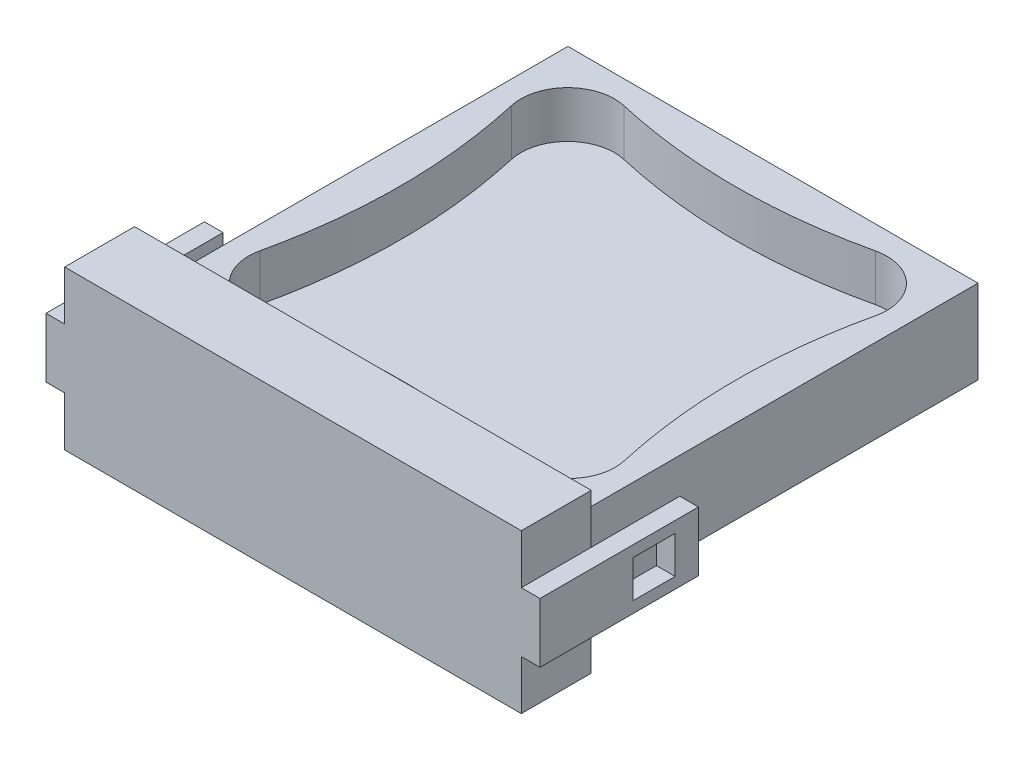
ISO-10303-21;
HEADER;
FILE_DESCRIPTION(('STEP AP214'),'2;1');
FILE_NAME('part.step','',(''),(''),'','','');
FILE_SCHEMA(('AUTOMOTIVE_DESIGN { 1 0 10303 214 1 1 1 1 }'));
ENDSEC;
DATA;
#1=APPLICATION_CONTEXT('core data for automotive mechanical design processes');
#2=APPLICATION_PROTOCOL_DEFINITION('international standard','automotive_design',2000,#1);
#3=PRODUCT_CONTEXT('',#1,'mechanical');
#4=PRODUCT('Part','Part','',(#3));
#5=PRODUCT_RELATED_PRODUCT_CATEGORY('part','',(#4));
#6=PRODUCT_DEFINITION_FORMATION('','',#4);
#7=PRODUCT_DEFINITION_CONTEXT('part definition',#1,'design');
#8=PRODUCT_DEFINITION('design','',#6,#7);
#9=PRODUCT_DEFINITION_SHAPE('','',#8);
#10=(LENGTH_UNIT() NAMED_UNIT(*) SI_UNIT(.MILLI.,.METRE.));
#11=(NAMED_UNIT(*) PLANE_ANGLE_UNIT() SI_UNIT($,.RADIAN.));
#12=(NAMED_UNIT(*) SI_UNIT($,.STERADIAN.) SOLID_ANGLE_UNIT());
#13=UNCERTAINTY_MEASURE_WITH_UNIT(LENGTH_MEASURE(1.E-05),#10,'distance_accuracy_value','');
#14=(GEOMETRIC_REPRESENTATION_CONTEXT(3) GLOBAL_UNCERTAINTY_ASSIGNED_CONTEXT((#13)) GLOBAL_UNIT_ASSIGNED_CONTEXT((#10,
#11,#12)) REPRESENTATION_CONTEXT('',''));
#15=CARTESIAN_POINT('',(0.,0.,0.));
#16=DIRECTION('',(0.,0.,1.));
#17=DIRECTION('',(1.,0.,0.));
#18=AXIS2_PLACEMENT_3D('',#15,#16,#17);
#19=CARTESIAN_POINT('',(-24.5,-4.,29.5));
#20=DIRECTION('',(1.,0.,0.));
#21=DIRECTION('',(0.,0.,-1.));
#22=AXIS2_PLACEMENT_3D('',#19,#20,#21);
#23=PLANE('',#22);
#24=DIRECTION('',(0.,-1.,0.));
#25=VECTOR('',#24,1.);
#26=CARTESIAN_POINT('',(-24.5,-4.,29.5));
#27=LINE('',#26,#25);
#28=CARTESIAN_POINT('',(-24.5,1.3,29.5));
#29=VERTEX_POINT('',#28);
#30=CARTESIAN_POINT('',(-24.5,-4.,29.5));
#31=VERTEX_POINT('',#30);
#32=EDGE_CURVE('E458',#29,#31,#27,.T.);
#33=ORIENTED_EDGE('',*,*,#32,.F.);
#34=DIRECTION('',(0.,0.,-1.));
#35=VECTOR('',#34,1.);
#36=CARTESIAN_POINT('',(-24.5,1.3,12.5));
#37=LINE('',#36,#35);
#38=CARTESIAN_POINT('',(-24.5,1.3,22.));
#39=VERTEX_POINT('',#38);
#40=EDGE_CURVE('E305',#29,#39,#37,.T.);
#41=ORIENTED_EDGE('',*,*,#40,.T.);
#42=DIRECTION('',(0.,-1.,0.));
#43=VECTOR('',#42,1.);
#44=CARTESIAN_POINT('',(-24.5,-4.,22.));
#45=LINE('',#44,#43);
#46=CARTESIAN_POINT('',(-24.5,-4.,22.));
#47=VERTEX_POINT('',#46);
#48=EDGE_CURVE('E481',#39,#47,#45,.T.);
#49=ORIENTED_EDGE('',*,*,#48,.T.);
#50=DIRECTION('',(0.,0.,-1.));
#51=VECTOR('',#50,1.);
#52=CARTESIAN_POINT('',(-24.5,-4.,29.5));
#53=LINE('',#52,#51);
#54=EDGE_CURVE('E462',#31,#47,#53,.T.);
#55=ORIENTED_EDGE('',*,*,#54,.F.);
#56=EDGE_LOOP('',(#33,#41,#49,#55));
#57=FACE_BOUND('',#56,.T.);
#58=ADVANCED_FACE('F33',(#57),#23,.F.);
#59=CARTESIAN_POINT('',(24.5,-4.,29.5));
#60=DIRECTION('',(-1.,0.,0.));
#61=DIRECTION('',(0.,0.,1.));
#62=AXIS2_PLACEMENT_3D('',#59,#60,#61);
#63=PLANE('',#62);
#64=DIRECTION('',(0.,0.,-1.));
#65=VECTOR('',#64,1.);
#66=CARTESIAN_POINT('',(24.5,1.3,12.5));
#67=LINE('',#66,#65);
#68=CARTESIAN_POINT('',(24.5,1.3,29.5));
#69=VERTEX_POINT('',#68);
#70=CARTESIAN_POINT('',(24.5,1.3,22.));
#71=VERTEX_POINT('',#70);
#72=EDGE_CURVE('E58',#69,#71,#67,.T.);
#73=ORIENTED_EDGE('',*,*,#72,.F.);
#74=DIRECTION('',(0.,1.,0.));
#75=VECTOR('',#74,1.);
#76=CARTESIAN_POINT('',(24.5,-4.,29.5));
#77=LINE('',#76,#75);
#78=CARTESIAN_POINT('',(24.5,-4.,29.5));
#79=VERTEX_POINT('',#78);
#80=EDGE_CURVE('E469',#79,#69,#77,.T.);
#81=ORIENTED_EDGE('',*,*,#80,.F.);
#82=DIRECTION('',(0.,0.,-1.));
#83=VECTOR('',#82,1.);
#84=CARTESIAN_POINT('',(24.5,-4.,29.5));
#85=LINE('',#84,#83);
#86=CARTESIAN_POINT('',(24.5,-4.,22.));
#87=VERTEX_POINT('',#86);
#88=EDGE_CURVE('E474',#79,#87,#85,.T.);
#89=ORIENTED_EDGE('',*,*,#88,.T.);
#90=DIRECTION('',(0.,1.,0.));
#91=VECTOR('',#90,1.);
#92=CARTESIAN_POINT('',(24.5,-4.,22.));
#93=LINE('',#92,#91);
#94=EDGE_CURVE('E475',#87,#71,#93,.T.);
#95=ORIENTED_EDGE('',*,*,#94,.T.);
#96=EDGE_LOOP('',(#73,#81,#89,#95));
#97=FACE_BOUND('',#96,.T.);
#98=ADVANCED_FACE('F431',(#97),#63,.F.);
#99=DIRECTION('',(0.,0.,1.));
#100=VECTOR('',#99,1.);
#101=CARTESIAN_POINT('',(24.5,7.7,29.5));
#102=LINE('',#101,#100);
#103=CARTESIAN_POINT('',(24.5,7.7,22.));
#104=VERTEX_POINT('',#103);
#105=CARTESIAN_POINT('',(24.5,7.7,29.5));
#106=VERTEX_POINT('',#105);
#107=EDGE_CURVE('E42',#104,#106,#102,.T.);
#108=ORIENTED_EDGE('',*,*,#107,.F.);
#109=CARTESIAN_POINT('',(24.5,13.,22.));
#110=VERTEX_POINT('',#109);
#111=EDGE_CURVE('E479',#104,#110,#93,.T.);
#112=ORIENTED_EDGE('',*,*,#111,.T.);
#113=DIRECTION('',(0.,0.,-1.));
#114=VECTOR('',#113,1.);
#115=CARTESIAN_POINT('',(24.5,13.,29.5));
#116=LINE('',#115,#114);
#117=CARTESIAN_POINT('',(24.5,13.,29.5));
#118=VERTEX_POINT('',#117);
#119=EDGE_CURVE('E495',#118,#110,#116,.T.);
#120=ORIENTED_EDGE('',*,*,#119,.F.);
#121=EDGE_CURVE('E488',#106,#118,#77,.T.);
#122=ORIENTED_EDGE('',*,*,#121,.F.);
#123=EDGE_LOOP('',(#108,#112,#120,#122));
#124=FACE_BOUND('',#123,.T.);
#125=ADVANCED_FACE('F434',(#124),#63,.F.);
#126=CARTESIAN_POINT('',(22.,9.,22.));
#127=DIRECTION('',(-1.,0.,0.));
#128=DIRECTION('',(0.,0.,1.));
#129=AXIS2_PLACEMENT_3D('',#126,#127,#128);
#130=PLANE('',#129);
#131=DIRECTION('',(0.,0.,-1.));
#132=VECTOR('',#131,1.);
#133=CARTESIAN_POINT('',(22.,0.,22.));
#134=LINE('',#133,#132);
#135=CARTESIAN_POINT('',(22.,0.,22.));
#136=VERTEX_POINT('',#135);
#137=CARTESIAN_POINT('',(22.,0.,-22.));
#138=VERTEX_POINT('',#137);
#139=EDGE_CURVE('E498',#136,#138,#134,.T.);
#140=ORIENTED_EDGE('',*,*,#139,.T.);
#141=DIRECTION('',(0.,-1.,0.));
#142=VECTOR('',#141,1.);
#143=CARTESIAN_POINT('',(22.,9.,-22.));
#144=LINE('',#143,#142);
#145=CARTESIAN_POINT('',(22.,9.,-22.));
#146=VERTEX_POINT('',#145);
#147=EDGE_CURVE('E37',#146,#138,#144,.T.);
#148=ORIENTED_EDGE('',*,*,#147,.F.);
#149=DIRECTION('',(0.,0.,-1.));
#150=VECTOR('',#149,1.);
#151=CARTESIAN_POINT('',(22.,9.,22.));
#152=LINE('',#151,#150);
#153=CARTESIAN_POINT('',(22.,9.,22.));
#154=VERTEX_POINT('',#153);
#155=EDGE_CURVE('E499',#154,#146,#152,.T.);
#156=ORIENTED_EDGE('',*,*,#155,.F.);
#157=DIRECTION('',(0.,-1.,0.));
#158=VECTOR('',#157,1.);
#159=CARTESIAN_POINT('',(22.,9.,22.));
#160=LINE('',#159,#158);
#161=EDGE_CURVE('E509',#154,#136,#160,.T.);
#162=ORIENTED_EDGE('',*,*,#161,.T.);
#163=EDGE_LOOP('',(#140,#148,#156,#162));
#164=FACE_BOUND('',#163,.T.);
#165=ADVANCED_FACE('F35',(#164),#130,.F.);
#166=CARTESIAN_POINT('',(-22.,9.,-22.));
#167=DIRECTION('',(0.,0.,1.));
#168=DIRECTION('',(1.,0.,0.));
#169=AXIS2_PLACEMENT_3D('',#166,#167,#168);
#170=PLANE('',#169);
#171=DIRECTION('',(-1.,0.,0.));
#172=VECTOR('',#171,1.);
#173=CARTESIAN_POINT('',(-22.,0.,-22.));
#174=LINE('',#173,#172);
#175=CARTESIAN_POINT('',(-22.,0.,-22.));
#176=VERTEX_POINT('',#175);
#177=EDGE_CURVE('E512',#138,#176,#174,.T.);
#178=ORIENTED_EDGE('',*,*,#177,.T.);
#179=DIRECTION('',(0.,-1.,0.));
#180=VECTOR('',#179,1.);
#181=CARTESIAN_POINT('',(-22.,9.,-22.));
#182=LINE('',#181,#180);
#183=CARTESIAN_POINT('',(-22.,9.,-22.));
#184=VERTEX_POINT('',#183);
#185=EDGE_CURVE('E522',#184,#176,#182,.T.);
#186=ORIENTED_EDGE('',*,*,#185,.F.);
#187=DIRECTION('',(-1.,0.,0.));
#188=VECTOR('',#187,1.);
#189=CARTESIAN_POINT('',(-22.,9.,-22.));
#190=LINE('',#189,#188);
#191=EDGE_CURVE('E502',#146,#184,#190,.T.);
#192=ORIENTED_EDGE('',*,*,#191,.F.);
#193=ORIENTED_EDGE('',*,*,#147,.T.);
#194=EDGE_LOOP('',(#178,#186,#192,#193));
#195=FACE_BOUND('',#194,.T.);
#196=ADVANCED_FACE('F444',(#195),#170,.F.);
#197=CARTESIAN_POINT('',(-22.,9.,22.));
#198=DIRECTION('',(1.,0.,0.));
#199=DIRECTION('',(0.,0.,-1.));
#200=AXIS2_PLACEMENT_3D('',#197,#198,#199);
#201=PLANE('',#200);
#202=DIRECTION('',(0.,0.,1.));
#203=VECTOR('',#202,1.);
#204=CARTESIAN_POINT('',(-22.,0.,22.));
#205=LINE('',#204,#203);
#206=CARTESIAN_POINT('',(-22.,0.,22.));
#207=VERTEX_POINT('',#206);
#208=EDGE_CURVE('E514',#176,#207,#205,.T.);
#209=ORIENTED_EDGE('',*,*,#208,.T.);
#210=DIRECTION('',(0.,-1.,0.));
#211=VECTOR('',#210,1.);
#212=CARTESIAN_POINT('',(-22.,9.,22.));
#213=LINE('',#212,#211);
#214=CARTESIAN_POINT('',(-22.,9.,22.));
#215=VERTEX_POINT('',#214);
#216=EDGE_CURVE('E520',#215,#207,#213,.T.);
#217=ORIENTED_EDGE('',*,*,#216,.F.);
#218=DIRECTION('',(0.,0.,1.));
#219=VECTOR('',#218,1.);
#220=CARTESIAN_POINT('',(-22.,9.,22.));
#221=LINE('',#220,#219);
#222=EDGE_CURVE('E505',#184,#215,#221,.T.);
#223=ORIENTED_EDGE('',*,*,#222,.F.);
#224=ORIENTED_EDGE('',*,*,#185,.T.);
#225=EDGE_LOOP('',(#209,#217,#223,#224));
#226=FACE_BOUND('',#225,.T.);
#227=ADVANCED_FACE('F438',(#226),#201,.F.);
#228=CARTESIAN_POINT('',(0.,9.,0.));
#229=DIRECTION('',(0.,-1.,0.));
#230=DIRECTION('',(0.,0.,-1.));
#231=AXIS2_PLACEMENT_3D('',#228,#229,#230);
#232=PLANE('',#231);
#233=CARTESIAN_POINT('',(14.6117194583374,9.,-14.582014450334));
#234=DIRECTION('',(0.,1.,0.));
#235=DIRECTION('',(0.,0.,-1.));
#236=AXIS2_PLACEMENT_3D('',#233,#234,#235);
#237=CIRCLE('',#236,5.03941281841845);
#238=CARTESIAN_POINT('',(19.5325,9.,-13.495));
#239=VERTEX_POINT('',#238);
#240=CARTESIAN_POINT('',(13.49,9.,-19.495));
#241=VERTEX_POINT('',#240);
#242=EDGE_CURVE('E624',#239,#241,#237,.T.);
#243=ORIENTED_EDGE('',*,*,#242,.F.);
#244=CARTESIAN_POINT('',(19.5325,9.,13.495));
#245=CARTESIAN_POINT('',(16.4925,9.,0.));
#246=CARTESIAN_POINT('',(19.5325,9.,-13.495));
#247=B_SPLINE_CURVE_WITH_KNOTS('',2,(#244,#245,#246),.UNSPECIFIED.,.F.,.F.,(3,3),(0.,1.),.UNSPECIFIED.);
#248=CARTESIAN_POINT('',(19.5325,9.,13.495));
#249=VERTEX_POINT('',#248);
#250=EDGE_CURVE('E388',#249,#239,#247,.T.);
#251=ORIENTED_EDGE('',*,*,#250,.F.);
#252=CARTESIAN_POINT('',(14.6117194583374,9.,14.5820144503339));
#253=DIRECTION('',(0.,1.,0.));
#254=DIRECTION('',(0.,0.,1.));
#255=AXIS2_PLACEMENT_3D('',#252,#253,#254);
#256=CIRCLE('',#255,5.03941281841845);
#257=CARTESIAN_POINT('',(13.49,9.,19.495));
#258=VERTEX_POINT('',#257);
#259=EDGE_CURVE('E396',#258,#249,#256,.T.);
#260=ORIENTED_EDGE('',*,*,#259,.F.);
#261=CARTESIAN_POINT('',(-13.49,9.,19.495));
#262=CARTESIAN_POINT('',(-4.49666666666666,9.,17.4416666666667));
#263=CARTESIAN_POINT('',(4.49666666666666,9.,17.4416666666667));
#264=CARTESIAN_POINT('',(13.49,9.,19.495));
#265=B_SPLINE_CURVE_WITH_KNOTS('',3,(#261,#262,#263,#264),.UNSPECIFIED.,.F.,.F.,(4,4),(0.,1.),.UNSPECIFIED.);
#266=CARTESIAN_POINT('',(-13.49,9.,19.495));
#267=VERTEX_POINT('',#266);
#268=EDGE_CURVE('E651',#267,#258,#265,.T.);
#269=ORIENTED_EDGE('',*,*,#268,.F.);
#270=CARTESIAN_POINT('',(-14.6291519635378,9.,14.5995704357795));
#271=DIRECTION('',(0.,1.,0.));
#272=DIRECTION('',(0.,0.,1.));
#273=AXIS2_PLACEMENT_3D('',#270,#271,#272);
#274=CIRCLE('',#273,5.02622102720083);
#275=CARTESIAN_POINT('',(-19.5325,9.,13.495));
#276=VERTEX_POINT('',#275);
#277=EDGE_CURVE('E646',#276,#267,#274,.T.);
#278=ORIENTED_EDGE('',*,*,#277,.F.);
#279=CARTESIAN_POINT('',(-19.5325,9.,-13.495));
#280=CARTESIAN_POINT('',(-18.5191666666667,9.,-8.99666666666668));
#281=CARTESIAN_POINT('',(-17.5058333333333,9.,0.));
#282=CARTESIAN_POINT('',(-18.5191666666667,9.,8.99666666666667));
#283=CARTESIAN_POINT('',(-19.5325,9.,13.495));
#284=B_SPLINE_CURVE_WITH_KNOTS('',3,(#279,#280,#281,#282,#283),.UNSPECIFIED.,.F.,.F.,(4,1,4),
(0.,0.5,1.),.UNSPECIFIED.);
#285=CARTESIAN_POINT('',(-19.5325,9.,-13.495));
#286=VERTEX_POINT('',#285);
#287=EDGE_CURVE('E641',#286,#276,#284,.T.);
#288=ORIENTED_EDGE('',*,*,#287,.F.);
#289=CARTESIAN_POINT('',(-14.6291519635378,9.,-14.5995704357795));
#290=DIRECTION('',(0.,1.,0.));
#291=DIRECTION('',(0.,0.,-1.));
#292=AXIS2_PLACEMENT_3D('',#289,#290,#291);
#293=CIRCLE('',#292,5.02622102720083);
#294=CARTESIAN_POINT('',(-13.49,9.,-19.495));
#295=VERTEX_POINT('',#294);
#296=EDGE_CURVE('E635',#295,#286,#293,.T.);
#297=ORIENTED_EDGE('',*,*,#296,.F.);
#298=CARTESIAN_POINT('',(13.49,9.,-19.495));
#299=CARTESIAN_POINT('',(4.49666666666667,9.,-17.4416666666667));
#300=CARTESIAN_POINT('',(-4.49666666666667,9.,-17.4416666666667));
#301=CARTESIAN_POINT('',(-13.49,9.,-19.495));
#302=B_SPLINE_CURVE_WITH_KNOTS('',3,(#298,#299,#300,#301),.UNSPECIFIED.,.F.,.F.,(4,4),(0.,1.),.UNSPECIFIED.);
#303=EDGE_CURVE('E630',#241,#295,#302,.T.);
#304=ORIENTED_EDGE('',*,*,#303,.F.);
#305=EDGE_LOOP('',(#243,#251,#260,#269,#278,#288,#297,#304));
#306=FACE_BOUND('',#305,.T.);
#307=ORIENTED_EDGE('',*,*,#155,.T.);
#308=ORIENTED_EDGE('',*,*,#191,.T.);
#309=ORIENTED_EDGE('',*,*,#222,.T.);
#310=DIRECTION('',(1.,0.,0.));
#311=VECTOR('',#310,1.);
#312=CARTESIAN_POINT('',(-22.,9.,22.));
#313=LINE('',#312,#311);
#314=EDGE_CURVE('E507',#215,#154,#313,.T.);
#315=ORIENTED_EDGE('',*,*,#314,.T.);
#316=EDGE_LOOP('',(#307,#308,#309,#315));
#317=FACE_BOUND('',#316,.T.);
#318=ADVANCED_FACE('F435',(#306,#317),#232,.F.);
#319=CARTESIAN_POINT('',(0.,0.,0.));
#320=DIRECTION('',(0.,-1.,0.));
#321=DIRECTION('',(0.,0.,-1.));
#322=AXIS2_PLACEMENT_3D('',#319,#320,#321);
#323=PLANE('',#322);
#324=ORIENTED_EDGE('',*,*,#139,.F.);
#325=DIRECTION('',(1.,0.,0.));
#326=VECTOR('',#325,1.);
#327=CARTESIAN_POINT('',(-22.,0.,22.));
#328=LINE('',#327,#326);
#329=EDGE_CURVE('E503',#207,#136,#328,.T.);
#330=ORIENTED_EDGE('',*,*,#329,.F.);
#331=ORIENTED_EDGE('',*,*,#208,.F.);
#332=ORIENTED_EDGE('',*,*,#177,.F.);
#333=EDGE_LOOP('',(#324,#330,#331,#332));
#334=FACE_BOUND('',#333,.T.);
#335=ADVANCED_FACE('F429',(#334),#323,.T.);
#336=CARTESIAN_POINT('',(-24.5,13.,29.5));
#337=DIRECTION('',(0.,-1.,0.));
#338=DIRECTION('',(0.,0.,-1.));
#339=AXIS2_PLACEMENT_3D('',#336,#337,#338);
#340=PLANE('',#339);
#341=DIRECTION('',(-1.,0.,0.));
#342=VECTOR('',#341,1.);
#343=CARTESIAN_POINT('',(-24.5,13.,22.));
#344=LINE('',#343,#342);
#345=CARTESIAN_POINT('',(-24.5,13.,22.));
#346=VERTEX_POINT('',#345);
#347=EDGE_CURVE('E477',#110,#346,#344,.T.);
#348=ORIENTED_EDGE('',*,*,#347,.T.);
#349=DIRECTION('',(0.,0.,-1.));
#350=VECTOR('',#349,1.);
#351=CARTESIAN_POINT('',(-24.5,13.,29.5));
#352=LINE('',#351,#350);
#353=CARTESIAN_POINT('',(-24.5,13.,29.5));
#354=VERTEX_POINT('',#353);
#355=EDGE_CURVE('E492',#354,#346,#352,.T.);
#356=ORIENTED_EDGE('',*,*,#355,.F.);
#357=DIRECTION('',(-1.,0.,0.));
#358=VECTOR('',#357,1.);
#359=CARTESIAN_POINT('',(-24.5,13.,29.5));
#360=LINE('',#359,#358);
#361=EDGE_CURVE('E465',#118,#354,#360,.T.);
#362=ORIENTED_EDGE('',*,*,#361,.F.);
#363=ORIENTED_EDGE('',*,*,#119,.T.);
#364=EDGE_LOOP('',(#348,#356,#362,#363));
#365=FACE_BOUND('',#364,.T.);
#366=ADVANCED_FACE('F425',(#365),#340,.F.);
#367=CARTESIAN_POINT('',(-24.5,7.7,22.));
#368=VERTEX_POINT('',#367);
#369=EDGE_CURVE('E482',#346,#368,#45,.T.);
#370=ORIENTED_EDGE('',*,*,#369,.T.);
#371=DIRECTION('',(0.,0.,1.));
#372=VECTOR('',#371,1.);
#373=CARTESIAN_POINT('',(-24.5,7.7,29.5));
#374=LINE('',#373,#372);
#375=CARTESIAN_POINT('',(-24.5,7.7,29.5));
#376=VERTEX_POINT('',#375);
#377=EDGE_CURVE('E11',#368,#376,#374,.T.);
#378=ORIENTED_EDGE('',*,*,#377,.T.);
#379=EDGE_CURVE('E464',#354,#376,#27,.T.);
#380=ORIENTED_EDGE('',*,*,#379,.F.);
#381=ORIENTED_EDGE('',*,*,#355,.T.);
#382=EDGE_LOOP('',(#370,#378,#380,#381));
#383=FACE_BOUND('',#382,.T.);
#384=ADVANCED_FACE('F421',(#383),#23,.F.);
#385=CARTESIAN_POINT('',(-24.5,-4.,29.5));
#386=DIRECTION('',(0.,1.,0.));
#387=DIRECTION('',(0.,0.,1.));
#388=AXIS2_PLACEMENT_3D('',#385,#386,#387);
#389=PLANE('',#388);
#390=DIRECTION('',(1.,0.,0.));
#391=VECTOR('',#390,1.);
#392=CARTESIAN_POINT('',(-24.5,-4.,22.));
#393=LINE('',#392,#391);
#394=EDGE_CURVE('E485',#47,#87,#393,.T.);
#395=ORIENTED_EDGE('',*,*,#394,.T.);
#396=ORIENTED_EDGE('',*,*,#88,.F.);
#397=DIRECTION('',(1.,0.,0.));
#398=VECTOR('',#397,1.);
#399=CARTESIAN_POINT('',(-24.5,-4.,29.5));
#400=LINE('',#399,#398);
#401=EDGE_CURVE('E468',#31,#79,#400,.T.);
#402=ORIENTED_EDGE('',*,*,#401,.F.);
#403=ORIENTED_EDGE('',*,*,#54,.T.);
#404=EDGE_LOOP('',(#395,#396,#402,#403));
#405=FACE_BOUND('',#404,.T.);
#406=ADVANCED_FACE('F414',(#405),#389,.F.);
#407=CARTESIAN_POINT('',(0.,0.,29.5));
#408=DIRECTION('',(0.,0.,-1.));
#409=DIRECTION('',(-1.,0.,0.));
#410=AXIS2_PLACEMENT_3D('',#407,#408,#409);
#411=PLANE('',#410);
#412=ORIENTED_EDGE('',*,*,#80,.T.);
#413=DIRECTION('',(-1.,0.,0.));
#414=VECTOR('',#413,1.);
#415=CARTESIAN_POINT('',(26.5,1.3,29.5));
#416=LINE('',#415,#414);
#417=CARTESIAN_POINT('',(26.5,1.3,29.5));
#418=VERTEX_POINT('',#417);
#419=EDGE_CURVE('E385',#418,#69,#416,.T.);
#420=ORIENTED_EDGE('',*,*,#419,.F.);
#421=DIRECTION('',(0.,-1.,0.));
#422=VECTOR('',#421,1.);
#423=CARTESIAN_POINT('',(26.5,1.3,29.5));
#424=LINE('',#423,#422);
#425=CARTESIAN_POINT('',(26.5,7.7,29.5));
#426=VERTEX_POINT('',#425);
#427=EDGE_CURVE('E360',#426,#418,#424,.T.);
#428=ORIENTED_EDGE('',*,*,#427,.F.);
#429=DIRECTION('',(-1.,0.,0.));
#430=VECTOR('',#429,1.);
#431=CARTESIAN_POINT('',(26.5,7.7,29.5));
#432=LINE('',#431,#430);
#433=EDGE_CURVE('E371',#426,#106,#432,.T.);
#434=ORIENTED_EDGE('',*,*,#433,.T.);
#435=ORIENTED_EDGE('',*,*,#121,.T.);
#436=ORIENTED_EDGE('',*,*,#361,.T.);
#437=ORIENTED_EDGE('',*,*,#379,.T.);
#438=DIRECTION('',(1.,0.,0.));
#439=VECTOR('',#438,1.);
#440=CARTESIAN_POINT('',(-26.5,7.7,29.5));
#441=LINE('',#440,#439);
#442=CARTESIAN_POINT('',(-26.5,7.7,29.5));
#443=VERTEX_POINT('',#442);
#444=EDGE_CURVE('E51',#443,#376,#441,.T.);
#445=ORIENTED_EDGE('',*,*,#444,.F.);
#446=DIRECTION('',(0.,-1.,0.));
#447=VECTOR('',#446,1.);
#448=CARTESIAN_POINT('',(-26.5,1.3,29.5));
#449=LINE('',#448,#447);
#450=CARTESIAN_POINT('',(-26.5,1.3,29.5));
#451=VERTEX_POINT('',#450);
#452=EDGE_CURVE('E301',#443,#451,#449,.T.);
#453=ORIENTED_EDGE('',*,*,#452,.T.);
#454=DIRECTION('',(1.,0.,0.));
#455=VECTOR('',#454,1.);
#456=CARTESIAN_POINT('',(-26.5,1.3,29.5));
#457=LINE('',#456,#455);
#458=EDGE_CURVE('E312',#451,#29,#457,.T.);
#459=ORIENTED_EDGE('',*,*,#458,.T.);
#460=ORIENTED_EDGE('',*,*,#32,.T.);
#461=ORIENTED_EDGE('',*,*,#401,.T.);
#462=EDGE_LOOP('',(#412,#420,#428,#434,#435,#436,#437,#445,#453,#459,#460,#461));
#463=FACE_BOUND('',#462,.T.);
#464=ADVANCED_FACE('F411',(#463),#411,.F.);
#465=CARTESIAN_POINT('',(0.,0.,22.));
#466=DIRECTION('',(0.,0.,-1.));
#467=DIRECTION('',(-1.,0.,0.));
#468=AXIS2_PLACEMENT_3D('',#465,#466,#467);
#469=PLANE('',#468);
#470=ORIENTED_EDGE('',*,*,#216,.T.);
#471=ORIENTED_EDGE('',*,*,#329,.T.);
#472=ORIENTED_EDGE('',*,*,#161,.F.);
#473=ORIENTED_EDGE('',*,*,#314,.F.);
#474=EDGE_LOOP('',(#470,#471,#472,#473));
#475=FACE_BOUND('',#474,.T.);
#476=ORIENTED_EDGE('',*,*,#94,.F.);
#477=ORIENTED_EDGE('',*,*,#394,.F.);
#478=ORIENTED_EDGE('',*,*,#48,.F.);
#479=EDGE_CURVE('E486',#368,#39,#45,.T.);
#480=ORIENTED_EDGE('',*,*,#479,.F.);
#481=ORIENTED_EDGE('',*,*,#369,.F.);
#482=ORIENTED_EDGE('',*,*,#347,.F.);
#483=ORIENTED_EDGE('',*,*,#111,.F.);
#484=EDGE_CURVE('E478',#71,#104,#93,.T.);
#485=ORIENTED_EDGE('',*,*,#484,.F.);
#486=EDGE_LOOP('',(#476,#477,#478,#480,#481,#482,#483,#485));
#487=FACE_BOUND('',#486,.T.);
#488=ADVANCED_FACE('F407',(#475,#487),#469,.T.);
#489=CARTESIAN_POINT('',(19.5325,4.,13.495));
#490=CARTESIAN_POINT('',(16.4925,4.,0.));
#491=CARTESIAN_POINT('',(19.5325,4.,-13.495));
#492=B_SPLINE_CURVE_WITH_KNOTS('',2,(#489,#490,#491),.UNSPECIFIED.,.F.,.F.,(3,3),(0.,1.),.UNSPECIFIED.);
#493=DIRECTION('',(0.,1.,0.));
#494=VECTOR('',#493,1.);
#495=SURFACE_OF_LINEAR_EXTRUSION('',#492,#494);
#496=ORIENTED_EDGE('',*,*,#250,.T.);
#497=DIRECTION('',(0.,1.,0.));
#498=VECTOR('',#497,1.);
#499=CARTESIAN_POINT('',(19.5325,4.,-13.495));
#500=LINE('',#499,#498);
#501=CARTESIAN_POINT('',(19.5325,4.,-13.495));
#502=VERTEX_POINT('',#501);
#503=EDGE_CURVE('E574',#502,#239,#500,.T.);
#504=ORIENTED_EDGE('',*,*,#503,.F.);
#505=CARTESIAN_POINT('',(19.5325,4.,13.495));
#506=VERTEX_POINT('',#505);
#507=EDGE_CURVE('E389',#506,#502,#492,.T.);
#508=ORIENTED_EDGE('',*,*,#507,.F.);
#509=DIRECTION('',(0.,1.,0.));
#510=VECTOR('',#509,1.);
#511=CARTESIAN_POINT('',(19.5325,4.,13.495));
#512=LINE('',#511,#510);
#513=EDGE_CURVE('E553',#506,#249,#512,.T.);
#514=ORIENTED_EDGE('',*,*,#513,.T.);
#515=EDGE_LOOP('',(#496,#504,#508,#514));
#516=FACE_BOUND('',#515,.T.);
#517=ADVANCED_FACE('F402',(#516),#495,.F.);
#518=CARTESIAN_POINT('',(14.6117194583374,4.,14.5820144503339));
#519=DIRECTION('',(0.,1.,0.));
#520=DIRECTION('',(0.,0.,1.));
#521=AXIS2_PLACEMENT_3D('',#518,#519,#520);
#522=CYLINDRICAL_SURFACE('',#521,5.03941281841845);
#523=ORIENTED_EDGE('',*,*,#259,.T.);
#524=ORIENTED_EDGE('',*,*,#513,.F.);
#525=CARTESIAN_POINT('',(14.6117194583374,4.,14.5820144503339));
#526=DIRECTION('',(0.,1.,0.));
#527=DIRECTION('',(0.,0.,1.));
#528=AXIS2_PLACEMENT_3D('',#525,#526,#527);
#529=CIRCLE('',#528,5.03941281841845);
#530=CARTESIAN_POINT('',(13.49,4.,19.495));
#531=VERTEX_POINT('',#530);
#532=EDGE_CURVE('E576',#531,#506,#529,.T.);
#533=ORIENTED_EDGE('',*,*,#532,.F.);
#534=DIRECTION('',(0.,1.,0.));
#535=VECTOR('',#534,1.);
#536=CARTESIAN_POINT('',(13.49,4.,19.495));
#537=LINE('',#536,#535);
#538=EDGE_CURVE('E556',#531,#258,#537,.T.);
#539=ORIENTED_EDGE('',*,*,#538,.T.);
#540=EDGE_LOOP('',(#523,#524,#533,#539));
#541=FACE_BOUND('',#540,.T.);
#542=ADVANCED_FACE('F406',(#541),#522,.F.);
#543=CARTESIAN_POINT('',(-13.49,4.,19.495));
#544=CARTESIAN_POINT('',(-4.49666666666666,4.,17.4416666666667));
#545=CARTESIAN_POINT('',(4.49666666666666,4.,17.4416666666667));
#546=CARTESIAN_POINT('',(13.49,4.,19.495));
#547=B_SPLINE_CURVE_WITH_KNOTS('',3,(#543,#544,#545,#546),.UNSPECIFIED.,.F.,.F.,(4,4),(0.,1.),.UNSPECIFIED.);
#548=DIRECTION('',(0.,1.,0.));
#549=VECTOR('',#548,1.);
#550=SURFACE_OF_LINEAR_EXTRUSION('',#547,#549);
#551=ORIENTED_EDGE('',*,*,#268,.T.);
#552=ORIENTED_EDGE('',*,*,#538,.F.);
#553=CARTESIAN_POINT('',(-13.49,4.,19.495));
#554=VERTEX_POINT('',#553);
#555=EDGE_CURVE('E607',#554,#531,#547,.T.);
#556=ORIENTED_EDGE('',*,*,#555,.F.);
#557=DIRECTION('',(0.,1.,0.));
#558=VECTOR('',#557,1.);
#559=CARTESIAN_POINT('',(-13.49,4.,19.495));
#560=LINE('',#559,#558);
#561=EDGE_CURVE('E560',#554,#267,#560,.T.);
#562=ORIENTED_EDGE('',*,*,#561,.T.);
#563=EDGE_LOOP('',(#551,#552,#556,#562));
#564=FACE_BOUND('',#563,.T.);
#565=ADVANCED_FACE('F599',(#564),#550,.F.);
#566=CARTESIAN_POINT('',(-14.6291519635378,4.,14.5995704357795));
#567=DIRECTION('',(0.,1.,0.));
#568=DIRECTION('',(0.,0.,1.));
#569=AXIS2_PLACEMENT_3D('',#566,#567,#568);
#570=CYLINDRICAL_SURFACE('',#569,5.02622102720083);
#571=ORIENTED_EDGE('',*,*,#277,.T.);
#572=ORIENTED_EDGE('',*,*,#561,.F.);
#573=CARTESIAN_POINT('',(-14.6291519635378,4.,14.5995704357795));
#574=DIRECTION('',(0.,1.,0.));
#575=DIRECTION('',(0.,0.,1.));
#576=AXIS2_PLACEMENT_3D('',#573,#574,#575);
#577=CIRCLE('',#576,5.02622102720083);
#578=CARTESIAN_POINT('',(-19.5325,4.,13.495));
#579=VERTEX_POINT('',#578);
#580=EDGE_CURVE('E614',#579,#554,#577,.T.);
#581=ORIENTED_EDGE('',*,*,#580,.F.);
#582=DIRECTION('',(0.,1.,0.));
#583=VECTOR('',#582,1.);
#584=CARTESIAN_POINT('',(-19.5325,4.,13.495));
#585=LINE('',#584,#583);
#586=EDGE_CURVE('E566',#579,#276,#585,.T.);
#587=ORIENTED_EDGE('',*,*,#586,.T.);
#588=EDGE_LOOP('',(#571,#572,#581,#587));
#589=FACE_BOUND('',#588,.T.);
#590=ADVANCED_FACE('F604',(#589),#570,.F.);
#591=CARTESIAN_POINT('',(-19.5325,4.,-13.495));
#592=CARTESIAN_POINT('',(-18.5191666666667,4.,-8.99666666666668));
#593=CARTESIAN_POINT('',(-17.5058333333333,4.,0.));
#594=CARTESIAN_POINT('',(-18.5191666666667,4.,8.99666666666667));
#595=CARTESIAN_POINT('',(-19.5325,4.,13.495));
#596=B_SPLINE_CURVE_WITH_KNOTS('',3,(#591,#592,#593,#594,#595),.UNSPECIFIED.,.F.,.F.,(4,1,4),
(0.,0.5,1.),.UNSPECIFIED.);
#597=DIRECTION('',(0.,1.,0.));
#598=VECTOR('',#597,1.);
#599=SURFACE_OF_LINEAR_EXTRUSION('',#596,#598);
#600=ORIENTED_EDGE('',*,*,#287,.T.);
#601=ORIENTED_EDGE('',*,*,#586,.F.);
#602=CARTESIAN_POINT('',(-19.5325,4.,-13.495));
#603=VERTEX_POINT('',#602);
#604=EDGE_CURVE('E682',#603,#579,#596,.T.);
#605=ORIENTED_EDGE('',*,*,#604,.F.);
#606=DIRECTION('',(0.,1.,0.));
#607=VECTOR('',#606,1.);
#608=CARTESIAN_POINT('',(-19.5325,4.,-13.495));
#609=LINE('',#608,#607);
#610=EDGE_CURVE('E568',#603,#286,#609,.T.);
#611=ORIENTED_EDGE('',*,*,#610,.T.);
#612=EDGE_LOOP('',(#600,#601,#605,#611));
#613=FACE_BOUND('',#612,.T.);
#614=ADVANCED_FACE('F680',(#613),#599,.F.);
#615=CARTESIAN_POINT('',(-14.6291519635378,4.,-14.5995704357795));
#616=DIRECTION('',(0.,1.,0.));
#617=DIRECTION('',(0.,0.,1.));
#618=AXIS2_PLACEMENT_3D('',#615,#616,#617);
#619=CYLINDRICAL_SURFACE('',#618,5.02622102720083);
#620=ORIENTED_EDGE('',*,*,#296,.T.);
#621=ORIENTED_EDGE('',*,*,#610,.F.);
#622=CARTESIAN_POINT('',(-14.6291519635378,4.,-14.5995704357795));
#623=DIRECTION('',(0.,1.,0.));
#624=DIRECTION('',(0.,0.,-1.));
#625=AXIS2_PLACEMENT_3D('',#622,#623,#624);
#626=CIRCLE('',#625,5.02622102720083);
#627=CARTESIAN_POINT('',(-13.49,4.,-19.495));
#628=VERTEX_POINT('',#627);
#629=EDGE_CURVE('E687',#628,#603,#626,.T.);
#630=ORIENTED_EDGE('',*,*,#629,.F.);
#631=DIRECTION('',(0.,1.,0.));
#632=VECTOR('',#631,1.);
#633=CARTESIAN_POINT('',(-13.49,4.,-19.495));
#634=LINE('',#633,#632);
#635=EDGE_CURVE('E570',#628,#295,#634,.T.);
#636=ORIENTED_EDGE('',*,*,#635,.T.);
#637=EDGE_LOOP('',(#620,#621,#630,#636));
#638=FACE_BOUND('',#637,.T.);
#639=ADVANCED_FACE('F686',(#638),#619,.F.);
#640=CARTESIAN_POINT('',(13.49,4.,-19.495));
#641=CARTESIAN_POINT('',(4.49666666666667,4.,-17.4416666666667));
#642=CARTESIAN_POINT('',(-4.49666666666667,4.,-17.4416666666667));
#643=CARTESIAN_POINT('',(-13.49,4.,-19.495));
#644=B_SPLINE_CURVE_WITH_KNOTS('',3,(#640,#641,#642,#643),.UNSPECIFIED.,.F.,.F.,(4,4),(0.,1.),.UNSPECIFIED.);
#645=DIRECTION('',(0.,1.,0.));
#646=VECTOR('',#645,1.);
#647=SURFACE_OF_LINEAR_EXTRUSION('',#644,#646);
#648=ORIENTED_EDGE('',*,*,#303,.T.);
#649=ORIENTED_EDGE('',*,*,#635,.F.);
#650=CARTESIAN_POINT('',(13.49,4.,-19.495));
#651=VERTEX_POINT('',#650);
#652=EDGE_CURVE('E670',#651,#628,#644,.T.);
#653=ORIENTED_EDGE('',*,*,#652,.F.);
#654=DIRECTION('',(0.,1.,0.));
#655=VECTOR('',#654,1.);
#656=CARTESIAN_POINT('',(13.49,4.,-19.495));
#657=LINE('',#656,#655);
#658=EDGE_CURVE('E572',#651,#241,#657,.T.);
#659=ORIENTED_EDGE('',*,*,#658,.T.);
#660=EDGE_LOOP('',(#648,#649,#653,#659));
#661=FACE_BOUND('',#660,.T.);
#662=ADVANCED_FACE('F689',(#661),#647,.F.);
#663=CARTESIAN_POINT('',(14.6117194583374,4.,-14.582014450334));
#664=DIRECTION('',(0.,1.,0.));
#665=DIRECTION('',(0.,0.,1.));
#666=AXIS2_PLACEMENT_3D('',#663,#664,#665);
#667=CYLINDRICAL_SURFACE('',#666,5.03941281841845);
#668=ORIENTED_EDGE('',*,*,#242,.T.);
#669=ORIENTED_EDGE('',*,*,#658,.F.);
#670=CARTESIAN_POINT('',(14.6117194583374,4.,-14.582014450334));
#671=DIRECTION('',(0.,1.,0.));
#672=DIRECTION('',(0.,0.,-1.));
#673=AXIS2_PLACEMENT_3D('',#670,#671,#672);
#674=CIRCLE('',#673,5.03941281841845);
#675=EDGE_CURVE('E395',#502,#651,#674,.T.);
#676=ORIENTED_EDGE('',*,*,#675,.F.);
#677=ORIENTED_EDGE('',*,*,#503,.T.);
#678=EDGE_LOOP('',(#668,#669,#676,#677));
#679=FACE_BOUND('',#678,.T.);
#680=ADVANCED_FACE('F409',(#679),#667,.F.);
#681=CARTESIAN_POINT('',(18.0125,4.,0.));
#682=DIRECTION('',(0.,-1.,0.));
#683=DIRECTION('',(0.,0.,-1.));
#684=AXIS2_PLACEMENT_3D('',#681,#682,#683);
#685=PLANE('',#684);
#686=ORIENTED_EDGE('',*,*,#507,.T.);
#687=ORIENTED_EDGE('',*,*,#675,.T.);
#688=ORIENTED_EDGE('',*,*,#652,.T.);
#689=ORIENTED_EDGE('',*,*,#629,.T.);
#690=ORIENTED_EDGE('',*,*,#604,.T.);
#691=ORIENTED_EDGE('',*,*,#580,.T.);
#692=ORIENTED_EDGE('',*,*,#555,.T.);
#693=ORIENTED_EDGE('',*,*,#532,.T.);
#694=EDGE_LOOP('',(#686,#687,#688,#689,#690,#691,#692,#693));
#695=FACE_BOUND('',#694,.T.);
#696=ADVANCED_FACE('F593',(#695),#685,.F.);
#697=CARTESIAN_POINT('',(26.5,0.,0.));
#698=DIRECTION('',(-1.,0.,0.));
#699=DIRECTION('',(0.,0.,1.));
#700=AXIS2_PLACEMENT_3D('',#697,#698,#699);
#701=PLANE('',#700);
#702=ORIENTED_EDGE('',*,*,#427,.T.);
#703=DIRECTION('',(0.,0.,-1.));
#704=VECTOR('',#703,1.);
#705=CARTESIAN_POINT('',(26.5,1.3,12.5));
#706=LINE('',#705,#704);
#707=CARTESIAN_POINT('',(26.5,1.3,12.5));
#708=VERTEX_POINT('',#707);
#709=EDGE_CURVE('E363',#418,#708,#706,.T.);
#710=ORIENTED_EDGE('',*,*,#709,.T.);
#711=DIRECTION('',(0.,1.,0.));
#712=VECTOR('',#711,1.);
#713=CARTESIAN_POINT('',(26.5,7.7,12.5));
#714=LINE('',#713,#712);
#715=CARTESIAN_POINT('',(26.5,7.7,12.5));
#716=VERTEX_POINT('',#715);
#717=EDGE_CURVE('E366',#708,#716,#714,.T.);
#718=ORIENTED_EDGE('',*,*,#717,.T.);
#719=DIRECTION('',(0.,0.,1.));
#720=VECTOR('',#719,1.);
#721=CARTESIAN_POINT('',(26.5,7.7,29.5));
#722=LINE('',#721,#720);
#723=EDGE_CURVE('E368',#716,#426,#722,.T.);
#724=ORIENTED_EDGE('',*,*,#723,.T.);
#725=EDGE_LOOP('',(#702,#710,#718,#724));
#726=FACE_BOUND('',#725,.T.);
#727=DIRECTION('',(0.,1.,0.));
#728=VECTOR('',#727,1.);
#729=CARTESIAN_POINT('',(26.5,2.5,15.));
#730=LINE('',#729,#728);
#731=CARTESIAN_POINT('',(26.5,2.5,15.));
#732=VERTEX_POINT('',#731);
#733=CARTESIAN_POINT('',(26.5,6.5,15.));
#734=VERTEX_POINT('',#733);
#735=EDGE_CURVE('E329',#732,#734,#730,.T.);
#736=ORIENTED_EDGE('',*,*,#735,.F.);
#737=DIRECTION('',(0.,0.,-1.));
#738=VECTOR('',#737,1.);
#739=CARTESIAN_POINT('',(26.5,2.5,19.5));
#740=LINE('',#739,#738);
#741=CARTESIAN_POINT('',(26.5,2.5,19.5));
#742=VERTEX_POINT('',#741);
#743=EDGE_CURVE('E337',#742,#732,#740,.T.);
#744=ORIENTED_EDGE('',*,*,#743,.F.);
#745=DIRECTION('',(0.,-1.,0.));
#746=VECTOR('',#745,1.);
#747=CARTESIAN_POINT('',(26.5,2.5,19.5));
#748=LINE('',#747,#746);
#749=CARTESIAN_POINT('',(26.5,6.5,19.5));
#750=VERTEX_POINT('',#749);
#751=EDGE_CURVE('E334',#750,#742,#748,.T.);
#752=ORIENTED_EDGE('',*,*,#751,.F.);
#753=DIRECTION('',(0.,0.,1.));
#754=VECTOR('',#753,1.);
#755=CARTESIAN_POINT('',(26.5,6.5,19.5));
#756=LINE('',#755,#754);
#757=EDGE_CURVE('E331',#734,#750,#756,.T.);
#758=ORIENTED_EDGE('',*,*,#757,.F.);
#759=EDGE_LOOP('',(#736,#744,#752,#758));
#760=FACE_BOUND('',#759,.T.);
#761=ADVANCED_FACE('F540',(#726,#760),#701,.F.);
#762=CARTESIAN_POINT('',(24.5,0.,0.));
#763=DIRECTION('',(-1.,0.,0.));
#764=DIRECTION('',(0.,0.,1.));
#765=AXIS2_PLACEMENT_3D('',#762,#763,#764);
#766=PLANE('',#765);
#767=CARTESIAN_POINT('',(24.5,1.3,12.5));
#768=VERTEX_POINT('',#767);
#769=EDGE_CURVE('E359',#71,#768,#67,.T.);
#770=ORIENTED_EDGE('',*,*,#769,.F.);
#771=ORIENTED_EDGE('',*,*,#484,.T.);
#772=CARTESIAN_POINT('',(24.5,7.7,12.5));
#773=VERTEX_POINT('',#772);
#774=EDGE_CURVE('E364',#773,#104,#102,.T.);
#775=ORIENTED_EDGE('',*,*,#774,.F.);
#776=DIRECTION('',(0.,1.,0.));
#777=VECTOR('',#776,1.);
#778=CARTESIAN_POINT('',(24.5,7.7,12.5));
#779=LINE('',#778,#777);
#780=EDGE_CURVE('E373',#768,#773,#779,.T.);
#781=ORIENTED_EDGE('',*,*,#780,.F.);
#782=EDGE_LOOP('',(#770,#771,#775,#781));
#783=FACE_BOUND('',#782,.T.);
#784=DIRECTION('',(0.,0.,-1.));
#785=VECTOR('',#784,1.);
#786=CARTESIAN_POINT('',(24.5,2.5,19.5));
#787=LINE('',#786,#785);
#788=CARTESIAN_POINT('',(24.5,2.5,19.5));
#789=VERTEX_POINT('',#788);
#790=CARTESIAN_POINT('',(24.5,2.5,15.));
#791=VERTEX_POINT('',#790);
#792=EDGE_CURVE('E332',#789,#791,#787,.T.);
#793=ORIENTED_EDGE('',*,*,#792,.T.);
#794=DIRECTION('',(0.,1.,0.));
#795=VECTOR('',#794,1.);
#796=CARTESIAN_POINT('',(24.5,2.5,15.));
#797=LINE('',#796,#795);
#798=CARTESIAN_POINT('',(24.5,6.5,15.));
#799=VERTEX_POINT('',#798);
#800=EDGE_CURVE('E328',#791,#799,#797,.T.);
#801=ORIENTED_EDGE('',*,*,#800,.T.);
#802=DIRECTION('',(0.,0.,1.));
#803=VECTOR('',#802,1.);
#804=CARTESIAN_POINT('',(24.5,6.5,19.5));
#805=LINE('',#804,#803);
#806=CARTESIAN_POINT('',(24.5,6.5,19.5));
#807=VERTEX_POINT('',#806);
#808=EDGE_CURVE('E342',#799,#807,#805,.T.);
#809=ORIENTED_EDGE('',*,*,#808,.T.);
#810=DIRECTION('',(0.,-1.,0.));
#811=VECTOR('',#810,1.);
#812=CARTESIAN_POINT('',(24.5,2.5,19.5));
#813=LINE('',#812,#811);
#814=EDGE_CURVE('E345',#807,#789,#813,.T.);
#815=ORIENTED_EDGE('',*,*,#814,.T.);
#816=EDGE_LOOP('',(#793,#801,#809,#815));
#817=FACE_BOUND('',#816,.T.);
#818=ADVANCED_FACE('F549',(#783,#817),#766,.T.);
#819=CARTESIAN_POINT('',(26.5,1.3,12.5));
#820=DIRECTION('',(0.,1.,0.));
#821=DIRECTION('',(0.,0.,1.));
#822=AXIS2_PLACEMENT_3D('',#819,#820,#821);
#823=PLANE('',#822);
#824=ORIENTED_EDGE('',*,*,#72,.T.);
#825=ORIENTED_EDGE('',*,*,#769,.T.);
#826=DIRECTION('',(-1.,0.,0.));
#827=VECTOR('',#826,1.);
#828=CARTESIAN_POINT('',(26.5,1.3,12.5));
#829=LINE('',#828,#827);
#830=EDGE_CURVE('E382',#708,#768,#829,.T.);
#831=ORIENTED_EDGE('',*,*,#830,.F.);
#832=ORIENTED_EDGE('',*,*,#709,.F.);
#833=ORIENTED_EDGE('',*,*,#419,.T.);
#834=EDGE_LOOP('',(#824,#825,#831,#832,#833));
#835=FACE_BOUND('',#834,.T.);
#836=ADVANCED_FACE('F579',(#835),#823,.F.);
#837=CARTESIAN_POINT('',(26.5,7.7,12.5));
#838=DIRECTION('',(0.,0.,1.));
#839=DIRECTION('',(1.,0.,0.));
#840=AXIS2_PLACEMENT_3D('',#837,#838,#839);
#841=PLANE('',#840);
#842=ORIENTED_EDGE('',*,*,#780,.T.);
#843=DIRECTION('',(-1.,0.,0.));
#844=VECTOR('',#843,1.);
#845=CARTESIAN_POINT('',(26.5,7.7,12.5));
#846=LINE('',#845,#844);
#847=EDGE_CURVE('E379',#716,#773,#846,.T.);
#848=ORIENTED_EDGE('',*,*,#847,.F.);
#849=ORIENTED_EDGE('',*,*,#717,.F.);
#850=ORIENTED_EDGE('',*,*,#830,.T.);
#851=EDGE_LOOP('',(#842,#848,#849,#850));
#852=FACE_BOUND('',#851,.T.);
#853=ADVANCED_FACE('F581',(#852),#841,.F.);
#854=CARTESIAN_POINT('',(26.5,7.7,29.5));
#855=DIRECTION('',(0.,-1.,0.));
#856=DIRECTION('',(0.,0.,-1.));
#857=AXIS2_PLACEMENT_3D('',#854,#855,#856);
#858=PLANE('',#857);
#859=ORIENTED_EDGE('',*,*,#774,.T.);
#860=ORIENTED_EDGE('',*,*,#107,.T.);
#861=ORIENTED_EDGE('',*,*,#433,.F.);
#862=ORIENTED_EDGE('',*,*,#723,.F.);
#863=ORIENTED_EDGE('',*,*,#847,.T.);
#864=EDGE_LOOP('',(#859,#860,#861,#862,#863));
#865=FACE_BOUND('',#864,.T.);
#866=ADVANCED_FACE('F532',(#865),#858,.F.);
#867=CARTESIAN_POINT('',(26.5,2.5,15.));
#868=DIRECTION('',(0.,0.,1.));
#869=DIRECTION('',(1.,0.,0.));
#870=AXIS2_PLACEMENT_3D('',#867,#868,#869);
#871=PLANE('',#870);
#872=ORIENTED_EDGE('',*,*,#800,.F.);
#873=DIRECTION('',(-1.,0.,0.));
#874=VECTOR('',#873,1.);
#875=CARTESIAN_POINT('',(26.5,2.5,15.));
#876=LINE('',#875,#874);
#877=EDGE_CURVE('E339',#732,#791,#876,.T.);
#878=ORIENTED_EDGE('',*,*,#877,.F.);
#879=ORIENTED_EDGE('',*,*,#735,.T.);
#880=DIRECTION('',(-1.,0.,0.));
#881=VECTOR('',#880,1.);
#882=CARTESIAN_POINT('',(26.5,6.5,15.));
#883=LINE('',#882,#881);
#884=EDGE_CURVE('E356',#734,#799,#883,.T.);
#885=ORIENTED_EDGE('',*,*,#884,.T.);
#886=EDGE_LOOP('',(#872,#878,#879,#885));
#887=FACE_BOUND('',#886,.T.);
#888=ADVANCED_FACE('F588',(#887),#871,.T.);
#889=CARTESIAN_POINT('',(26.5,6.5,19.5));
#890=DIRECTION('',(0.,-1.,0.));
#891=DIRECTION('',(0.,0.,-1.));
#892=AXIS2_PLACEMENT_3D('',#889,#890,#891);
#893=PLANE('',#892);
#894=ORIENTED_EDGE('',*,*,#808,.F.);
#895=ORIENTED_EDGE('',*,*,#884,.F.);
#896=ORIENTED_EDGE('',*,*,#757,.T.);
#897=DIRECTION('',(-1.,0.,0.));
#898=VECTOR('',#897,1.);
#899=CARTESIAN_POINT('',(26.5,6.5,19.5));
#900=LINE('',#899,#898);
#901=EDGE_CURVE('E354',#750,#807,#900,.T.);
#902=ORIENTED_EDGE('',*,*,#901,.T.);
#903=EDGE_LOOP('',(#894,#895,#896,#902));
#904=FACE_BOUND('',#903,.T.);
#905=ADVANCED_FACE('F877',(#904),#893,.T.);
#906=CARTESIAN_POINT('',(26.5,2.5,19.5));
#907=DIRECTION('',(0.,0.,-1.));
#908=DIRECTION('',(-1.,0.,0.));
#909=AXIS2_PLACEMENT_3D('',#906,#907,#908);
#910=PLANE('',#909);
#911=ORIENTED_EDGE('',*,*,#814,.F.);
#912=ORIENTED_EDGE('',*,*,#901,.F.);
#913=ORIENTED_EDGE('',*,*,#751,.T.);
#914=DIRECTION('',(-1.,0.,0.));
#915=VECTOR('',#914,1.);
#916=CARTESIAN_POINT('',(26.5,2.5,19.5));
#917=LINE('',#916,#915);
#918=EDGE_CURVE('E352',#742,#789,#917,.T.);
#919=ORIENTED_EDGE('',*,*,#918,.T.);
#920=EDGE_LOOP('',(#911,#912,#913,#919));
#921=FACE_BOUND('',#920,.T.);
#922=ADVANCED_FACE('F886',(#921),#910,.T.);
#923=CARTESIAN_POINT('',(26.5,2.5,19.5));
#924=DIRECTION('',(0.,1.,0.));
#925=DIRECTION('',(0.,0.,1.));
#926=AXIS2_PLACEMENT_3D('',#923,#924,#925);
#927=PLANE('',#926);
#928=ORIENTED_EDGE('',*,*,#792,.F.);
#929=ORIENTED_EDGE('',*,*,#918,.F.);
#930=ORIENTED_EDGE('',*,*,#743,.T.);
#931=ORIENTED_EDGE('',*,*,#877,.T.);
#932=EDGE_LOOP('',(#928,#929,#930,#931));
#933=FACE_BOUND('',#932,.T.);
#934=ADVANCED_FACE('F895',(#933),#927,.T.);
#935=CARTESIAN_POINT('',(-26.5,7.7,29.5));
#936=DIRECTION('',(0.,1.,0.));
#937=DIRECTION('',(0.,0.,1.));
#938=AXIS2_PLACEMENT_3D('',#935,#936,#937);
#939=PLANE('',#938);
#940=CARTESIAN_POINT('',(-24.5,7.7,12.5));
#941=VERTEX_POINT('',#940);
#942=EDGE_CURVE('E44',#941,#368,#374,.T.);
#943=ORIENTED_EDGE('',*,*,#942,.F.);
#944=DIRECTION('',(1.,0.,0.));
#945=VECTOR('',#944,1.);
#946=CARTESIAN_POINT('',(-26.5,7.7,12.5));
#947=LINE('',#946,#945);
#948=CARTESIAN_POINT('',(-26.5,7.7,12.5));
#949=VERTEX_POINT('',#948);
#950=EDGE_CURVE('E325',#949,#941,#947,.T.);
#951=ORIENTED_EDGE('',*,*,#950,.F.);
#952=DIRECTION('',(0.,0.,1.));
#953=VECTOR('',#952,1.);
#954=CARTESIAN_POINT('',(-26.5,7.7,29.5));
#955=LINE('',#954,#953);
#956=EDGE_CURVE('E304',#949,#443,#955,.T.);
#957=ORIENTED_EDGE('',*,*,#956,.T.);
#958=ORIENTED_EDGE('',*,*,#444,.T.);
#959=ORIENTED_EDGE('',*,*,#377,.F.);
#960=EDGE_LOOP('',(#943,#951,#957,#958,#959));
#961=FACE_BOUND('',#960,.T.);
#962=ADVANCED_FACE('F903',(#961),#939,.T.);
#963=CARTESIAN_POINT('',(-26.5,7.7,12.5));
#964=DIRECTION('',(0.,0.,-1.));
#965=DIRECTION('',(-1.,0.,0.));
#966=AXIS2_PLACEMENT_3D('',#963,#964,#965);
#967=PLANE('',#966);
#968=DIRECTION('',(0.,1.,0.));
#969=VECTOR('',#968,1.);
#970=CARTESIAN_POINT('',(-24.5,7.7,12.5));
#971=LINE('',#970,#969);
#972=CARTESIAN_POINT('',(-24.5,1.3,12.5));
#973=VERTEX_POINT('',#972);
#974=EDGE_CURVE('E315',#973,#941,#971,.T.);
#975=ORIENTED_EDGE('',*,*,#974,.F.);
#976=DIRECTION('',(1.,0.,0.));
#977=VECTOR('',#976,1.);
#978=CARTESIAN_POINT('',(-26.5,1.3,12.5));
#979=LINE('',#978,#977);
#980=CARTESIAN_POINT('',(-26.5,1.3,12.5));
#981=VERTEX_POINT('',#980);
#982=EDGE_CURVE('E322',#981,#973,#979,.T.);
#983=ORIENTED_EDGE('',*,*,#982,.F.);
#984=DIRECTION('',(0.,1.,0.));
#985=VECTOR('',#984,1.);
#986=CARTESIAN_POINT('',(-26.5,7.7,12.5));
#987=LINE('',#986,#985);
#988=EDGE_CURVE('E307',#981,#949,#987,.T.);
#989=ORIENTED_EDGE('',*,*,#988,.T.);
#990=ORIENTED_EDGE('',*,*,#950,.T.);
#991=EDGE_LOOP('',(#975,#983,#989,#990));
#992=FACE_BOUND('',#991,.T.);
#993=ADVANCED_FACE('F915',(#992),#967,.T.);
#994=CARTESIAN_POINT('',(-26.5,1.3,12.5));
#995=DIRECTION('',(0.,-1.,0.));
#996=DIRECTION('',(0.,0.,-1.));
#997=AXIS2_PLACEMENT_3D('',#994,#995,#996);
#998=PLANE('',#997);
#999=ORIENTED_EDGE('',*,*,#40,.F.);
#1000=ORIENTED_EDGE('',*,*,#458,.F.);
#1001=DIRECTION('',(0.,0.,-1.));
#1002=VECTOR('',#1001,1.);
#1003=CARTESIAN_POINT('',(-26.5,1.3,12.5));
#1004=LINE('',#1003,#1002);
#1005=EDGE_CURVE('E310',#451,#981,#1004,.T.);
#1006=ORIENTED_EDGE('',*,*,#1005,.T.);
#1007=ORIENTED_EDGE('',*,*,#982,.T.);
#1008=EDGE_CURVE('E318',#39,#973,#37,.T.);
#1009=ORIENTED_EDGE('',*,*,#1008,.F.);
#1010=EDGE_LOOP('',(#999,#1000,#1006,#1007,#1009));
#1011=FACE_BOUND('',#1010,.T.);
#1012=ADVANCED_FACE('F922',(#1011),#998,.T.);
#1013=CARTESIAN_POINT('',(-26.5,0.,0.));
#1014=DIRECTION('',(1.,0.,0.));
#1015=DIRECTION('',(0.,0.,1.));
#1016=AXIS2_PLACEMENT_3D('',#1013,#1014,#1015);
#1017=PLANE('',#1016);
#1018=DIRECTION('',(0.,0.,-1.));
#1019=VECTOR('',#1018,1.);
#1020=CARTESIAN_POINT('',(-26.5,2.5,19.5));
#1021=LINE('',#1020,#1019);
#1022=CARTESIAN_POINT('',(-26.5,2.5,19.5));
#1023=VERTEX_POINT('',#1022);
#1024=CARTESIAN_POINT('',(-26.5,2.5,15.));
#1025=VERTEX_POINT('',#1024);
#1026=EDGE_CURVE('E263',#1023,#1025,#1021,.T.);
#1027=ORIENTED_EDGE('',*,*,#1026,.T.);
#1028=DIRECTION('',(0.,1.,0.));
#1029=VECTOR('',#1028,1.);
#1030=CARTESIAN_POINT('',(-26.5,2.5,15.));
#1031=LINE('',#1030,#1029);
#1032=CARTESIAN_POINT('',(-26.5,6.5,15.));
#1033=VERTEX_POINT('',#1032);
#1034=EDGE_CURVE('E272',#1025,#1033,#1031,.T.);
#1035=ORIENTED_EDGE('',*,*,#1034,.T.);
#1036=DIRECTION('',(0.,0.,1.));
#1037=VECTOR('',#1036,1.);
#1038=CARTESIAN_POINT('',(-26.5,6.5,19.5));
#1039=LINE('',#1038,#1037);
#1040=CARTESIAN_POINT('',(-26.5,6.5,19.5));
#1041=VERTEX_POINT('',#1040);
#1042=EDGE_CURVE('E285',#1033,#1041,#1039,.T.);
#1043=ORIENTED_EDGE('',*,*,#1042,.T.);
#1044=DIRECTION('',(0.,-1.,0.));
#1045=VECTOR('',#1044,1.);
#1046=CARTESIAN_POINT('',(-26.5,2.5,19.5));
#1047=LINE('',#1046,#1045);
#1048=EDGE_CURVE('E283',#1041,#1023,#1047,.T.);
#1049=ORIENTED_EDGE('',*,*,#1048,.T.);
#1050=EDGE_LOOP('',(#1027,#1035,#1043,#1049));
#1051=FACE_BOUND('',#1050,.T.);
#1052=ORIENTED_EDGE('',*,*,#452,.F.);
#1053=ORIENTED_EDGE('',*,*,#956,.F.);
#1054=ORIENTED_EDGE('',*,*,#988,.F.);
#1055=ORIENTED_EDGE('',*,*,#1005,.F.);
#1056=EDGE_LOOP('',(#1052,#1053,#1054,#1055));
#1057=FACE_BOUND('',#1056,.T.);
#1058=ADVANCED_FACE('F281',(#1051,#1057),#1017,.F.);
#1059=CARTESIAN_POINT('',(-24.5,0.,0.));
#1060=DIRECTION('',(1.,0.,0.));
#1061=DIRECTION('',(0.,0.,1.));
#1062=AXIS2_PLACEMENT_3D('',#1059,#1060,#1061);
#1063=PLANE('',#1062);
#1064=DIRECTION('',(0.,1.,0.));
#1065=VECTOR('',#1064,1.);
#1066=CARTESIAN_POINT('',(-24.5,2.5,15.));
#1067=LINE('',#1066,#1065);
#1068=CARTESIAN_POINT('',(-24.5,2.5,15.));
#1069=VERTEX_POINT('',#1068);
#1070=CARTESIAN_POINT('',(-24.5,6.5,15.));
#1071=VERTEX_POINT('',#1070);
#1072=EDGE_CURVE('E289',#1069,#1071,#1067,.T.);
#1073=ORIENTED_EDGE('',*,*,#1072,.F.);
#1074=DIRECTION('',(0.,0.,-1.));
#1075=VECTOR('',#1074,1.);
#1076=CARTESIAN_POINT('',(-24.5,2.5,19.5));
#1077=LINE('',#1076,#1075);
#1078=CARTESIAN_POINT('',(-24.5,2.5,19.5));
#1079=VERTEX_POINT('',#1078);
#1080=EDGE_CURVE('E266',#1079,#1069,#1077,.T.);
#1081=ORIENTED_EDGE('',*,*,#1080,.F.);
#1082=DIRECTION('',(0.,-1.,0.));
#1083=VECTOR('',#1082,1.);
#1084=CARTESIAN_POINT('',(-24.5,2.5,19.5));
#1085=LINE('',#1084,#1083);
#1086=CARTESIAN_POINT('',(-24.5,6.5,19.5));
#1087=VERTEX_POINT('',#1086);
#1088=EDGE_CURVE('E292',#1087,#1079,#1085,.T.);
#1089=ORIENTED_EDGE('',*,*,#1088,.F.);
#1090=DIRECTION('',(0.,0.,1.));
#1091=VECTOR('',#1090,1.);
#1092=CARTESIAN_POINT('',(-24.5,6.5,19.5));
#1093=LINE('',#1092,#1091);
#1094=EDGE_CURVE('E279',#1071,#1087,#1093,.T.);
#1095=ORIENTED_EDGE('',*,*,#1094,.F.);
#1096=EDGE_LOOP('',(#1073,#1081,#1089,#1095));
#1097=FACE_BOUND('',#1096,.T.);
#1098=ORIENTED_EDGE('',*,*,#942,.T.);
#1099=ORIENTED_EDGE('',*,*,#479,.T.);
#1100=ORIENTED_EDGE('',*,*,#1008,.T.);
#1101=ORIENTED_EDGE('',*,*,#974,.T.);
#1102=EDGE_LOOP('',(#1098,#1099,#1100,#1101));
#1103=FACE_BOUND('',#1102,.T.);
#1104=ADVANCED_FACE('F937',(#1097,#1103),#1063,.T.);
#1105=CARTESIAN_POINT('',(-26.5,2.5,15.));
#1106=DIRECTION('',(0.,0.,-1.));
#1107=DIRECTION('',(-1.,0.,0.));
#1108=AXIS2_PLACEMENT_3D('',#1105,#1106,#1107);
#1109=PLANE('',#1108);
#1110=ORIENTED_EDGE('',*,*,#1072,.T.);
#1111=DIRECTION('',(1.,0.,0.));
#1112=VECTOR('',#1111,1.);
#1113=CARTESIAN_POINT('',(-26.5,6.5,15.));
#1114=LINE('',#1113,#1112);
#1115=EDGE_CURVE('E275',#1033,#1071,#1114,.T.);
#1116=ORIENTED_EDGE('',*,*,#1115,.F.);
#1117=ORIENTED_EDGE('',*,*,#1034,.F.);
#1118=DIRECTION('',(1.,0.,0.));
#1119=VECTOR('',#1118,1.);
#1120=CARTESIAN_POINT('',(-26.5,2.5,15.));
#1121=LINE('',#1120,#1119);
#1122=EDGE_CURVE('E259',#1025,#1069,#1121,.T.);
#1123=ORIENTED_EDGE('',*,*,#1122,.T.);
#1124=EDGE_LOOP('',(#1110,#1116,#1117,#1123));
#1125=FACE_BOUND('',#1124,.T.);
#1126=ADVANCED_FACE('F273',(#1125),#1109,.F.);
#1127=CARTESIAN_POINT('',(-26.5,2.5,19.5));
#1128=DIRECTION('',(0.,-1.,0.));
#1129=DIRECTION('',(0.,0.,-1.));
#1130=AXIS2_PLACEMENT_3D('',#1127,#1128,#1129);
#1131=PLANE('',#1130);
#1132=ORIENTED_EDGE('',*,*,#1080,.T.);
#1133=ORIENTED_EDGE('',*,*,#1122,.F.);
#1134=ORIENTED_EDGE('',*,*,#1026,.F.);
#1135=DIRECTION('',(1.,0.,0.));
#1136=VECTOR('',#1135,1.);
#1137=CARTESIAN_POINT('',(-26.5,2.5,19.5));
#1138=LINE('',#1137,#1136);
#1139=EDGE_CURVE('E269',#1023,#1079,#1138,.T.);
#1140=ORIENTED_EDGE('',*,*,#1139,.T.);
#1141=EDGE_LOOP('',(#1132,#1133,#1134,#1140));
#1142=FACE_BOUND('',#1141,.T.);
#1143=ADVANCED_FACE('F261',(#1142),#1131,.F.);
#1144=CARTESIAN_POINT('',(-26.5,2.5,19.5));
#1145=DIRECTION('',(0.,0.,1.));
#1146=DIRECTION('',(1.,0.,0.));
#1147=AXIS2_PLACEMENT_3D('',#1144,#1145,#1146);
#1148=PLANE('',#1147);
#1149=ORIENTED_EDGE('',*,*,#1088,.T.);
#1150=ORIENTED_EDGE('',*,*,#1139,.F.);
#1151=ORIENTED_EDGE('',*,*,#1048,.F.);
#1152=DIRECTION('',(1.,0.,0.));
#1153=VECTOR('',#1152,1.);
#1154=CARTESIAN_POINT('',(-26.5,6.5,19.5));
#1155=LINE('',#1154,#1153);
#1156=EDGE_CURVE('E298',#1041,#1087,#1155,.T.);
#1157=ORIENTED_EDGE('',*,*,#1156,.T.);
#1158=EDGE_LOOP('',(#1149,#1150,#1151,#1157));
#1159=FACE_BOUND('',#1158,.T.);
#1160=ADVANCED_FACE('F957',(#1159),#1148,.F.);
#1161=CARTESIAN_POINT('',(-26.5,6.5,19.5));
#1162=DIRECTION('',(0.,1.,0.));
#1163=DIRECTION('',(0.,0.,1.));
#1164=AXIS2_PLACEMENT_3D('',#1161,#1162,#1163);
#1165=PLANE('',#1164);
#1166=ORIENTED_EDGE('',*,*,#1094,.T.);
#1167=ORIENTED_EDGE('',*,*,#1156,.F.);
#1168=ORIENTED_EDGE('',*,*,#1042,.F.);
#1169=ORIENTED_EDGE('',*,*,#1115,.T.);
#1170=EDGE_LOOP('',(#1166,#1167,#1168,#1169));
#1171=FACE_BOUND('',#1170,.T.);
#1172=ADVANCED_FACE('F964',(#1171),#1165,.F.);
#1173=CLOSED_SHELL('',(#58,#98,#125,#165,#196,#227,#318,#335,#366,#384,#406,#464,#488,#517,#542,
#565,#590,#614,#639,#662,#680,#696,#761,#818,#836,#853,#866,#888,#905,#922,#934,#962,#993,#1012,
#1058,#1104,#1126,#1143,#1160,#1172));
#1174=MANIFOLD_SOLID_BREP('B2',#1173);
#1175=ADVANCED_BREP_SHAPE_REPRESENTATION('',(#18,#1174),#14);
#1176=SHAPE_DEFINITION_REPRESENTATION(#9,#1175);
ENDSEC;
END-ISO-10303-21;
